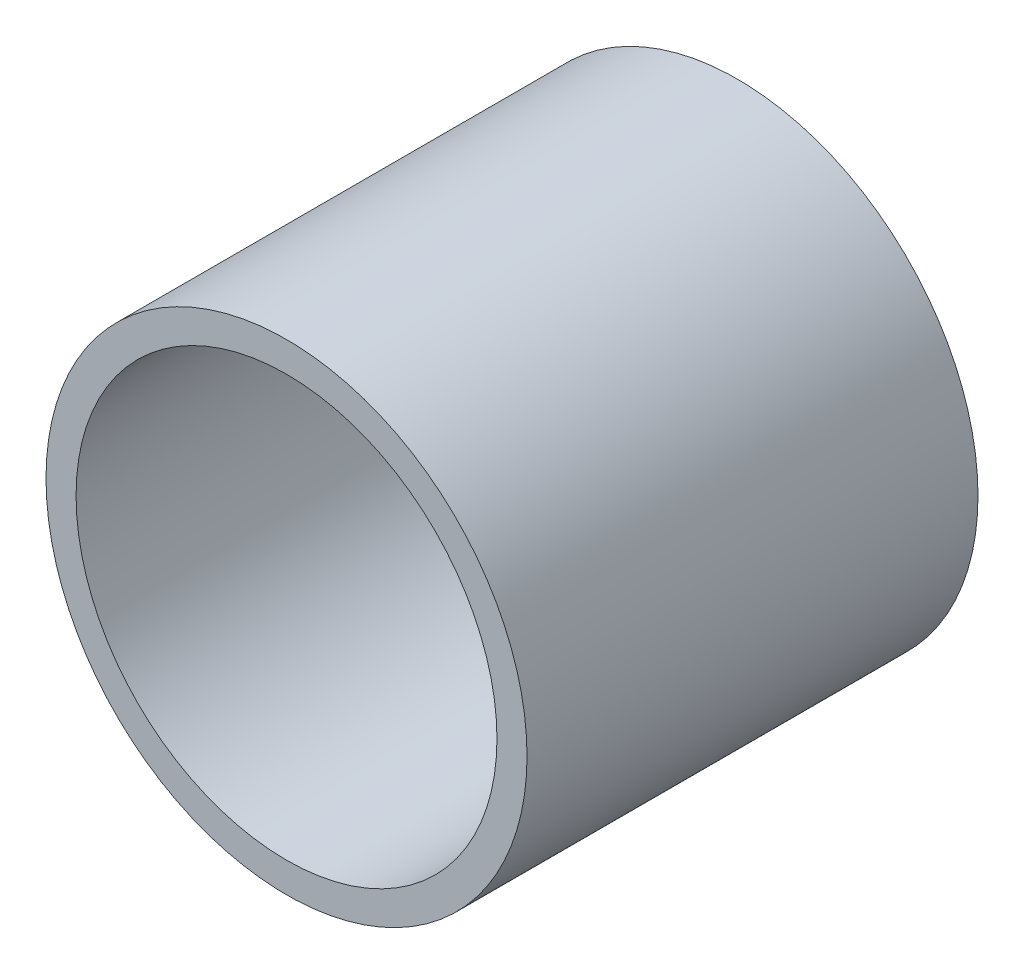
ISO-10303-21;
HEADER;
FILE_DESCRIPTION(('STEP AP214'),'2;1');
FILE_NAME('part.step','',(''),(''),'','','');
FILE_SCHEMA(('AUTOMOTIVE_DESIGN { 1 0 10303 214 1 1 1 1 }'));
ENDSEC;
DATA;
#1=APPLICATION_CONTEXT('core data for automotive mechanical design processes');
#2=APPLICATION_PROTOCOL_DEFINITION('international standard','automotive_design',2000,#1);
#3=PRODUCT_CONTEXT('',#1,'mechanical');
#4=PRODUCT('Part','Part','',(#3));
#5=PRODUCT_RELATED_PRODUCT_CATEGORY('part','',(#4));
#6=PRODUCT_DEFINITION_FORMATION('','',#4);
#7=PRODUCT_DEFINITION_CONTEXT('part definition',#1,'design');
#8=PRODUCT_DEFINITION('design','',#6,#7);
#9=PRODUCT_DEFINITION_SHAPE('','',#8);
#10=(LENGTH_UNIT() NAMED_UNIT(*) SI_UNIT(.MILLI.,.METRE.));
#11=(NAMED_UNIT(*) PLANE_ANGLE_UNIT() SI_UNIT($,.RADIAN.));
#12=(NAMED_UNIT(*) SI_UNIT($,.STERADIAN.) SOLID_ANGLE_UNIT());
#13=UNCERTAINTY_MEASURE_WITH_UNIT(LENGTH_MEASURE(1.E-05),#10,'distance_accuracy_value','');
#14=(GEOMETRIC_REPRESENTATION_CONTEXT(3) GLOBAL_UNCERTAINTY_ASSIGNED_CONTEXT((#13)) GLOBAL_UNIT_ASSIGNED_CONTEXT((#10,
#11,#12)) REPRESENTATION_CONTEXT('',''));
#15=CARTESIAN_POINT('',(0.,0.,0.));
#16=DIRECTION('',(0.,0.,1.));
#17=DIRECTION('',(1.,0.,0.));
#18=AXIS2_PLACEMENT_3D('',#15,#16,#17);
#19=CARTESIAN_POINT('',(0.,1.43543123543124,1.5));
#20=DIRECTION('',(0.,0.,-1.));
#21=DIRECTION('',(-1.,0.,0.));
#22=AXIS2_PLACEMENT_3D('',#19,#20,#21);
#23=PLANE('',#22);
#24=CARTESIAN_POINT('',(0.,-0.164568764568765,1.5));
#25=DIRECTION('',(0.,0.,1.));
#26=DIRECTION('',(1.,0.,0.));
#27=AXIS2_PLACEMENT_3D('',#24,#25,#26);
#28=CIRCLE('',#27,1.4);
#29=CARTESIAN_POINT('',(1.4,-0.164568764568765,1.5));
#30=VERTEX_POINT('',#29);
#31=EDGE_CURVE('E10',#30,#30,#28,.T.);
#32=ORIENTED_EDGE('',*,*,#31,.F.);
#33=EDGE_LOOP('',(#32));
#34=FACE_BOUND('',#33,.T.);
#35=CARTESIAN_POINT('',(0.,-0.164568764568765,1.5));
#36=DIRECTION('',(0.,0.,1.));
#37=DIRECTION('',(1.,0.,0.));
#38=AXIS2_PLACEMENT_3D('',#35,#36,#37);
#39=CIRCLE('',#38,1.6);
#40=CARTESIAN_POINT('',(1.6,-0.164568764568765,1.5));
#41=VERTEX_POINT('',#40);
#42=EDGE_CURVE('E54',#41,#41,#39,.T.);
#43=ORIENTED_EDGE('',*,*,#42,.T.);
#44=EDGE_LOOP('',(#43));
#45=FACE_BOUND('',#44,.T.);
#46=ADVANCED_FACE('F37',(#34,#45),#23,.F.);
#47=CARTESIAN_POINT('',(0.,-0.164568764568765,-0.499996));
#48=DIRECTION('',(0.,0.,1.));
#49=DIRECTION('',(1.,0.,0.));
#50=AXIS2_PLACEMENT_3D('',#47,#48,#49);
#51=CYLINDRICAL_SURFACE('',#50,1.4);
#52=CARTESIAN_POINT('',(0.,-0.164568764568765,-1.5));
#53=DIRECTION('',(0.,0.,1.));
#54=DIRECTION('',(1.,0.,0.));
#55=AXIS2_PLACEMENT_3D('',#52,#53,#54);
#56=CIRCLE('',#55,1.4);
#57=CARTESIAN_POINT('',(1.4,-0.164568764568765,-1.5));
#58=VERTEX_POINT('',#57);
#59=EDGE_CURVE('E44',#58,#58,#56,.T.);
#60=ORIENTED_EDGE('',*,*,#59,.F.);
#61=EDGE_LOOP('',(#60));
#62=FACE_BOUND('',#61,.T.);
#63=ORIENTED_EDGE('',*,*,#31,.T.);
#64=EDGE_LOOP('',(#63));
#65=FACE_BOUND('',#64,.T.);
#66=ADVANCED_FACE('F70',(#62,#65),#51,.F.);
#67=CARTESIAN_POINT('',(0.,1.43543123543124,-1.5));
#68=DIRECTION('',(0.,0.,1.));
#69=DIRECTION('',(1.,0.,0.));
#70=AXIS2_PLACEMENT_3D('',#67,#68,#69);
#71=PLANE('',#70);
#72=CARTESIAN_POINT('',(0.,-0.164568764568765,-1.5));
#73=DIRECTION('',(0.,0.,1.));
#74=DIRECTION('',(1.,0.,0.));
#75=AXIS2_PLACEMENT_3D('',#72,#73,#74);
#76=CIRCLE('',#75,1.6);
#77=CARTESIAN_POINT('',(1.6,-0.164568764568765,-1.5));
#78=VERTEX_POINT('',#77);
#79=EDGE_CURVE('E49',#78,#78,#76,.T.);
#80=ORIENTED_EDGE('',*,*,#79,.F.);
#81=EDGE_LOOP('',(#80));
#82=FACE_BOUND('',#81,.T.);
#83=ORIENTED_EDGE('',*,*,#59,.T.);
#84=EDGE_LOOP('',(#83));
#85=FACE_BOUND('',#84,.T.);
#86=ADVANCED_FACE('F65',(#82,#85),#71,.F.);
#87=CARTESIAN_POINT('',(0.,-0.164568764568765,-0.499996));
#88=DIRECTION('',(0.,0.,1.));
#89=DIRECTION('',(1.,0.,0.));
#90=AXIS2_PLACEMENT_3D('',#87,#88,#89);
#91=CYLINDRICAL_SURFACE('',#90,1.6);
#92=ORIENTED_EDGE('',*,*,#42,.F.);
#93=EDGE_LOOP('',(#92));
#94=FACE_BOUND('',#93,.T.);
#95=ORIENTED_EDGE('',*,*,#79,.T.);
#96=EDGE_LOOP('',(#95));
#97=FACE_BOUND('',#96,.T.);
#98=ADVANCED_FACE('F62',(#94,#97),#91,.T.);
#99=CLOSED_SHELL('',(#46,#66,#86,#98));
#100=MANIFOLD_SOLID_BREP('B2',#99);
#101=ADVANCED_BREP_SHAPE_REPRESENTATION('',(#18,#100),#14);
#102=SHAPE_DEFINITION_REPRESENTATION(#9,#101);
ENDSEC;
END-ISO-10303-21;
